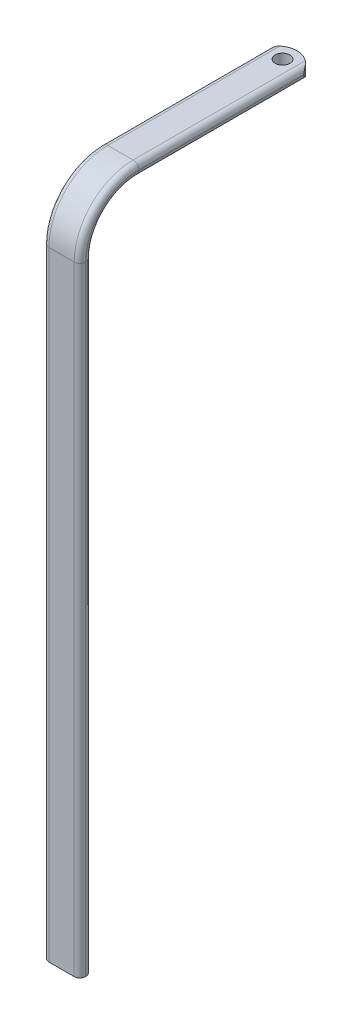
ISO-10303-21;
HEADER;
FILE_DESCRIPTION(('STEP AP214'),'2;1');
FILE_NAME('part.step','',(''),(''),'','','');
FILE_SCHEMA(('AUTOMOTIVE_DESIGN { 1 0 10303 214 1 1 1 1 }'));
ENDSEC;
DATA;
#1=APPLICATION_CONTEXT('core data for automotive mechanical design processes');
#2=APPLICATION_PROTOCOL_DEFINITION('international standard','automotive_design',2000,#1);
#3=PRODUCT_CONTEXT('',#1,'mechanical');
#4=PRODUCT('Part','Part','',(#3));
#5=PRODUCT_RELATED_PRODUCT_CATEGORY('part','',(#4));
#6=PRODUCT_DEFINITION_FORMATION('','',#4);
#7=PRODUCT_DEFINITION_CONTEXT('part definition',#1,'design');
#8=PRODUCT_DEFINITION('design','',#6,#7);
#9=PRODUCT_DEFINITION_SHAPE('','',#8);
#10=(LENGTH_UNIT() NAMED_UNIT(*) SI_UNIT(.MILLI.,.METRE.));
#11=(NAMED_UNIT(*) PLANE_ANGLE_UNIT() SI_UNIT($,.RADIAN.));
#12=(NAMED_UNIT(*) SI_UNIT($,.STERADIAN.) SOLID_ANGLE_UNIT());
#13=UNCERTAINTY_MEASURE_WITH_UNIT(LENGTH_MEASURE(1.E-05),#10,'distance_accuracy_value','');
#14=(GEOMETRIC_REPRESENTATION_CONTEXT(3) GLOBAL_UNCERTAINTY_ASSIGNED_CONTEXT((#13)) GLOBAL_UNIT_ASSIGNED_CONTEXT((#10,
#11,#12)) REPRESENTATION_CONTEXT('',''));
#15=CARTESIAN_POINT('',(0.,0.,0.));
#16=DIRECTION('',(0.,0.,1.));
#17=DIRECTION('',(1.,0.,0.));
#18=AXIS2_PLACEMENT_3D('',#15,#16,#17);
#19=CARTESIAN_POINT('',(10.5,227.9,-20.));
#20=DIRECTION('',(0.,0.,-1.));
#21=DIRECTION('',(-1.,0.,0.));
#22=AXIS2_PLACEMENT_3D('',#19,#20,#21);
#23=CYLINDRICAL_SURFACE('',#22,1.9);
#24=CARTESIAN_POINT('',(12.4,227.9,-76.));
#25=CARTESIAN_POINT('',(12.4000039886726,227.873806271057,-75.9999888760673));
#26=CARTESIAN_POINT('',(12.3994579999188,227.847629320959,-76.0011409460232));
#27=CARTESIAN_POINT('',(12.397304870018,227.795553200889,-76.0056674990028));
#28=CARTESIAN_POINT('',(12.3956994282265,227.76965365346,-76.0090384229779));
#29=CARTESIAN_POINT('',(12.3894132316495,227.693386741234,-76.0221958260334));
#30=CARTESIAN_POINT('',(12.3832599744014,227.643648484299,-76.0350337198619));
#31=CARTESIAN_POINT('',(12.3650460932504,227.531486133612,-76.0725608007253));
#32=CARTESIAN_POINT('',(12.3517217413397,227.470129793832,-76.0997341911328));
#33=CARTESIAN_POINT('',(12.3204537034474,227.352563779117,-76.1620964892458));
#34=CARTESIAN_POINT('',(12.3024787910066,227.296392520357,-76.1973393886364));
#35=CARTESIAN_POINT('',(12.2648834983558,227.194424899646,-76.2692324559926));
#36=CARTESIAN_POINT('',(12.2456020458715,227.148151936548,-76.3053981234561));
#37=CARTESIAN_POINT('',(12.2045361049354,227.059194070327,-76.3806343366665));
#38=CARTESIAN_POINT('',(12.182749574176,227.016512144653,-76.4197072432999));
#39=CARTESIAN_POINT('',(12.1140115543373,226.893084345266,-76.5399913060167));
#40=CARTESIAN_POINT('',(12.0637290121805,226.817078091103,-76.6241751603708));
#41=CARTESIAN_POINT('',(11.9630742501943,226.685395994687,-76.7841452811863));
#42=CARTESIAN_POINT('',(11.9136882346023,226.628362870559,-76.8594699167269));
#43=CARTESIAN_POINT('',(11.8095009758109,226.521308748569,-77.0114480235751));
#44=CARTESIAN_POINT('',(11.7546964838332,226.471292001546,-77.0881022690948));
#45=CARTESIAN_POINT('',(11.639968401803,226.378185992107,-77.2415341391299));
#46=CARTESIAN_POINT('',(11.5800531686587,226.335085740463,-77.3183113681883));
#47=CARTESIAN_POINT('',(11.4551452797332,226.255869654153,-77.4713341410249));
#48=CARTESIAN_POINT('',(11.3901532407727,226.219752972846,-77.5475797481717));
#49=CARTESIAN_POINT('',(11.2616930004956,226.158046605552,-77.6916086026697));
#50=CARTESIAN_POINT('',(11.1986748223333,226.131780053465,-77.7595030517766));
#51=CARTESIAN_POINT('',(11.0687886474057,226.085827399774,-77.8937801321461));
#52=CARTESIAN_POINT('',(11.0019222800155,226.066138536772,-77.9601633868931));
#53=CARTESIAN_POINT('',(10.8644206281101,226.03393578905,-78.0910760597136));
#54=CARTESIAN_POINT('',(10.7937776209771,226.021437272592,-78.1556012290506));
#55=CARTESIAN_POINT('',(10.6492123958767,226.004472132983,-78.2821795880287));
#56=CARTESIAN_POINT('',(10.5752855586271,226.000017216354,-78.3442290464292));
#57=CARTESIAN_POINT('',(10.5,226.,-78.4047103832078));
#58=B_SPLINE_CURVE_WITH_KNOTS('',3,(#24,#25,#26,#27,#28,#29,#30,#31,#32,#33,#34,#35,#36,#37,#38,
#39,#40,#41,#42,#43,#44,#45,#46,#47,#48,#49,#50,#51,#52,#53,#54,#55,#56,#57),.UNSPECIFIED.,.F.,
.F.,(4,2,2,2,2,2,2,2,2,2,2,2,2,2,2,2,4),(0.,0.0785202128572147,0.156914784965549,
0.311333860283347,0.515440192471966,0.720954279759613,0.906128226338106,1.09145422406289,
1.4625817243948,1.78206370568672,2.1017384153395,2.42090007255307,2.74002301247223,
3.02858760718773,3.31703090607165,3.60608843936753,3.89556632411547),.UNSPECIFIED.);
#59=CARTESIAN_POINT('',(12.4,227.9,-76.));
#60=VERTEX_POINT('',#59);
#61=CARTESIAN_POINT('',(10.5,226.,-78.4047103832078));
#62=VERTEX_POINT('',#61);
#63=EDGE_CURVE('E183',#60,#62,#58,.T.);
#64=ORIENTED_EDGE('',*,*,#63,.F.);
#65=DIRECTION('',(0.,0.,-1.));
#66=VECTOR('',#65,1.);
#67=CARTESIAN_POINT('',(12.4,227.9,-20.));
#68=LINE('',#67,#66);
#69=CARTESIAN_POINT('',(12.4,227.9,-20.));
#70=VERTEX_POINT('',#69);
#71=EDGE_CURVE('E25',#70,#60,#68,.T.);
#72=ORIENTED_EDGE('',*,*,#71,.F.);
#73=CARTESIAN_POINT('',(10.5,227.9,-20.));
#74=DIRECTION('',(0.,0.,-1.));
#75=DIRECTION('',(0.,-1.,0.));
#76=AXIS2_PLACEMENT_3D('',#73,#74,#75);
#77=CIRCLE('',#76,1.9);
#78=CARTESIAN_POINT('',(10.5,226.,-20.));
#79=VERTEX_POINT('',#78);
#80=EDGE_CURVE('E181',#70,#79,#77,.T.);
#81=ORIENTED_EDGE('',*,*,#80,.T.);
#82=DIRECTION('',(0.,0.,-1.));
#83=VECTOR('',#82,1.);
#84=CARTESIAN_POINT('',(10.5,226.,-20.));
#85=LINE('',#84,#83);
#86=EDGE_CURVE('E170',#79,#62,#85,.T.);
#87=ORIENTED_EDGE('',*,*,#86,.T.);
#88=EDGE_LOOP('',(#64,#72,#81,#87));
#89=FACE_BOUND('',#88,.T.);
#90=ADVANCED_FACE('F17',(#89),#23,.T.);
#91=CARTESIAN_POINT('',(1.9,226.,-20.));
#92=DIRECTION('',(0.,-1.,0.));
#93=DIRECTION('',(0.,0.,-1.));
#94=AXIS2_PLACEMENT_3D('',#91,#92,#93);
#95=PLANE('',#94);
#96=CARTESIAN_POINT('',(6.2,226.,-73.0542465172055));
#97=DIRECTION('',(0.,-1.,0.));
#98=DIRECTION('',(0.,0.,-1.));
#99=AXIS2_PLACEMENT_3D('',#96,#97,#98);
#100=CIRCLE('',#99,6.86421616656962);
#101=CARTESIAN_POINT('',(1.9,226.,-78.4047103832078));
#102=VERTEX_POINT('',#101);
#103=EDGE_CURVE('E335',#62,#102,#100,.F.);
#104=ORIENTED_EDGE('',*,*,#103,.F.);
#105=ORIENTED_EDGE('',*,*,#86,.F.);
#106=DIRECTION('',(-1.,0.,0.));
#107=VECTOR('',#106,1.);
#108=CARTESIAN_POINT('',(1.9,226.,-20.));
#109=LINE('',#108,#107);
#110=CARTESIAN_POINT('',(1.9,226.,-20.));
#111=VERTEX_POINT('',#110);
#112=EDGE_CURVE('E190',#79,#111,#109,.T.);
#113=ORIENTED_EDGE('',*,*,#112,.T.);
#114=DIRECTION('',(0.,0.,-1.));
#115=VECTOR('',#114,1.);
#116=CARTESIAN_POINT('',(1.9,226.,-20.));
#117=LINE('',#116,#115);
#118=EDGE_CURVE('E167',#111,#102,#117,.T.);
#119=ORIENTED_EDGE('',*,*,#118,.T.);
#120=EDGE_LOOP('',(#104,#105,#113,#119));
#121=FACE_BOUND('',#120,.T.);
#122=CARTESIAN_POINT('',(6.2,226.,-75.));
#123=DIRECTION('',(0.,-1.,0.));
#124=DIRECTION('',(0.,0.,-1.));
#125=AXIS2_PLACEMENT_3D('',#122,#123,#124);
#126=CIRCLE('',#125,2.5);
#127=CARTESIAN_POINT('',(6.2,226.,-77.5));
#128=VERTEX_POINT('',#127);
#129=EDGE_CURVE('E239',#128,#128,#126,.T.);
#130=ORIENTED_EDGE('',*,*,#129,.F.);
#131=EDGE_LOOP('',(#130));
#132=FACE_BOUND('',#131,.T.);
#133=ADVANCED_FACE('F338',(#121,#132),#95,.T.);
#134=CARTESIAN_POINT('',(1.9,227.9,-20.));
#135=DIRECTION('',(0.,0.,-1.));
#136=DIRECTION('',(-1.,0.,0.));
#137=AXIS2_PLACEMENT_3D('',#134,#135,#136);
#138=CYLINDRICAL_SURFACE('',#137,1.9);
#139=CARTESIAN_POINT('',(1.9,226.,-78.4047103832078));
#140=CARTESIAN_POINT('',(1.83711279584305,226.000008274471,-78.3541786712364));
#141=CARTESIAN_POINT('',(1.775170071014,226.003120622737,-78.302563320145));
#142=CARTESIAN_POINT('',(1.65350580345606,226.01506521073,-78.1975223643931));
#143=CARTESIAN_POINT('',(1.59378215319916,226.023891868533,-78.1440985744878));
#144=CARTESIAN_POINT('',(1.4187628353019,226.058122961575,-77.9819674964389));
#145=CARTESIAN_POINT('',(1.30706964261362,226.091287175651,-77.8709575772025));
#146=CARTESIAN_POINT('',(1.08145650570991,226.180547254876,-77.6311832773445));
#147=CARTESIAN_POINT('',(0.968995038522396,226.238986597781,-77.5019308637489));
#148=CARTESIAN_POINT('',(0.811244001702309,226.341619814429,-77.3069882763855));
#149=CARTESIAN_POINT('',(0.760414878017264,226.378394010338,-77.2417299665403));
#150=CARTESIAN_POINT('',(0.662518809556247,226.456887495647,-77.1113897724482));
#151=CARTESIAN_POINT('',(0.61545116074426,226.498605855999,-77.0463078573991));
#152=CARTESIAN_POINT('',(0.499741425241474,226.611951714494,-76.8804263373852));
#153=CARTESIAN_POINT('',(0.433843529875936,226.687210032873,-76.7801126968921));
#154=CARTESIAN_POINT('',(0.342708118865225,226.810309845184,-76.633759864111));
#155=CARTESIAN_POINT('',(0.313642348855369,226.852993172531,-76.5857119309615));
#156=CARTESIAN_POINT('',(0.258237415794232,226.942202660478,-76.4916709751971));
#157=CARTESIAN_POINT('',(0.231896669542325,226.988726561185,-76.4456767683262));
#158=CARTESIAN_POINT('',(0.182091384395307,227.086476858022,-76.3564977677626));
#159=CARTESIAN_POINT('',(0.158645614768199,227.137730523617,-76.3133320805189));
#160=CARTESIAN_POINT('',(0.115354718208621,227.245468026654,-76.2317739137346));
#161=CARTESIAN_POINT('',(0.0955111830883199,227.301954159731,-76.1933835467353));
#162=CARTESIAN_POINT('',(0.0631364467011609,227.41146989876,-76.1295428045705));
#163=CARTESIAN_POINT('',(0.0499469970744282,227.463658512826,-76.1030076872775));
#164=CARTESIAN_POINT('',(0.0277132533765342,227.572020212111,-76.0577409086192));
#165=CARTESIAN_POINT('',(0.0186497365536778,227.628173381991,-76.0389730972916));
#166=CARTESIAN_POINT('',(0.00816096168706774,227.720636529829,-76.0171304086468));
#167=CARTESIAN_POINT('',(0.00513223286449089,227.755997369045,-76.0107841779591));
#168=CARTESIAN_POINT('',(0.00103738972427453,227.827550977197,-76.0021836597316));
#169=CARTESIAN_POINT('',(-1.59185047112454E-05,227.863747644961,-75.9999560734959));
#170=CARTESIAN_POINT('',(0.,227.9,-76.));
#171=B_SPLINE_CURVE_WITH_KNOTS('',3,(#139,#140,#141,#142,#143,#144,#145,#146,#147,#148,#149,
#150,#151,#152,#153,#154,#155,#156,#157,#158,#159,#160,#161,#162,#163,#164,#165,#166,#167,#168,
#169,#170),.UNSPECIFIED.,.F.,.F.,(4,2,2,2,2,2,2,2,2,2,2,2,2,2,2,4),(0.,0.241855605073987,
0.483475313448054,0.964620469544646,1.50575154197843,1.77714431394214,2.04848616971289,
2.47234804889616,2.68381907541955,2.8951665419806,3.10781936290637,3.32056592667132,
3.50004060914779,3.67867033789836,3.78655306933386,3.89513278817063),.UNSPECIFIED.);
#172=CARTESIAN_POINT('',(0.,227.9,-76.));
#173=VERTEX_POINT('',#172);
#174=EDGE_CURVE('E32',#102,#173,#171,.T.);
#175=ORIENTED_EDGE('',*,*,#174,.F.);
#176=ORIENTED_EDGE('',*,*,#118,.F.);
#177=CARTESIAN_POINT('',(1.9,227.9,-20.));
#178=DIRECTION('',(0.,0.,-1.));
#179=DIRECTION('',(0.,-1.,0.));
#180=AXIS2_PLACEMENT_3D('',#177,#178,#179);
#181=CIRCLE('',#180,1.9);
#182=CARTESIAN_POINT('',(0.,227.9,-20.));
#183=VERTEX_POINT('',#182);
#184=EDGE_CURVE('E196',#111,#183,#181,.T.);
#185=ORIENTED_EDGE('',*,*,#184,.T.);
#186=DIRECTION('',(0.,0.,-1.));
#187=VECTOR('',#186,1.);
#188=CARTESIAN_POINT('',(0.,227.9,-20.));
#189=LINE('',#188,#187);
#190=EDGE_CURVE('E159',#183,#173,#189,.T.);
#191=ORIENTED_EDGE('',*,*,#190,.T.);
#192=EDGE_LOOP('',(#175,#176,#185,#191));
#193=FACE_BOUND('',#192,.T.);
#194=ADVANCED_FACE('F294',(#193),#138,.T.);
#195=CARTESIAN_POINT('',(1.9,228.1,-20.));
#196=DIRECTION('',(0.,0.,-1.));
#197=DIRECTION('',(-1.,0.,0.));
#198=AXIS2_PLACEMENT_3D('',#195,#196,#197);
#199=CYLINDRICAL_SURFACE('',#198,1.9);
#200=CARTESIAN_POINT('',(0.,228.1,-76.));
#201=CARTESIAN_POINT('',(-3.98867262817255E-06,228.126193728943,-75.9999888760673));
#202=CARTESIAN_POINT('',(0.000542000081220153,228.152370679041,-76.0011409460232));
#203=CARTESIAN_POINT('',(0.00269512998195583,228.204446799111,-76.0056674990028));
#204=CARTESIAN_POINT('',(0.00430057177346251,228.23034634654,-76.0090384229779));
#205=CARTESIAN_POINT('',(0.0105867683505166,228.306613258766,-76.0221958260334));
#206=CARTESIAN_POINT('',(0.0167400255985739,228.356351515701,-76.0350337198619));
#207=CARTESIAN_POINT('',(0.0349539067496436,228.468513866389,-76.0725608007253));
#208=CARTESIAN_POINT('',(0.0482782586603467,228.529870206169,-76.0997341911329));
#209=CARTESIAN_POINT('',(0.0795462965526777,228.647436220883,-76.1620964892459));
#210=CARTESIAN_POINT('',(0.0975212089934196,228.703607479644,-76.1973393886364));
#211=CARTESIAN_POINT('',(0.135116501644238,228.805575100355,-76.2692324559926));
#212=CARTESIAN_POINT('',(0.154397954128531,228.851848063452,-76.3053981234562));
#213=CARTESIAN_POINT('',(0.195463895064684,228.940805929673,-76.3806343366666));
#214=CARTESIAN_POINT('',(0.217250425824034,228.983487855347,-76.4197072433001));
#215=CARTESIAN_POINT('',(0.285988445662687,229.106915654734,-76.5399913060167));
#216=CARTESIAN_POINT('',(0.336270987819435,229.182921908897,-76.6241751603708));
#217=CARTESIAN_POINT('',(0.436925749805716,229.314604005313,-76.7841452811863));
#218=CARTESIAN_POINT('',(0.486311765397746,229.371637129441,-76.8594699167269));
#219=CARTESIAN_POINT('',(0.590499024189134,229.478691251431,-77.0114480235751));
#220=CARTESIAN_POINT('',(0.645303516166796,229.528707998454,-77.0881022690948));
#221=CARTESIAN_POINT('',(0.760031598197047,229.621814007893,-77.2415341391299));
#222=CARTESIAN_POINT('',(0.819946831341359,229.664914259537,-77.3183113681883));
#223=CARTESIAN_POINT('',(0.944854720266765,229.744130345847,-77.4713341410249));
#224=CARTESIAN_POINT('',(1.00984675922729,229.780247027154,-77.5475797481717));
#225=CARTESIAN_POINT('',(1.13830699950432,229.841953394448,-77.6916086026697));
#226=CARTESIAN_POINT('',(1.20132517766663,229.868219946535,-77.7595030517766));
#227=CARTESIAN_POINT('',(1.3312113525943,229.914172600225,-77.893780132146));
#228=CARTESIAN_POINT('',(1.39807771998452,229.933861463228,-77.9601633868931));
#229=CARTESIAN_POINT('',(1.53557937188988,229.96606421095,-78.0910760597136));
#230=CARTESIAN_POINT('',(1.60622237902287,229.978562727408,-78.1556012290505));
#231=CARTESIAN_POINT('',(1.75078760412331,229.995527867017,-78.2821795880287));
#232=CARTESIAN_POINT('',(1.82471444137294,229.999982783646,-78.3442290464292));
#233=CARTESIAN_POINT('',(1.9,230.,-78.4047103832078));
#234=B_SPLINE_CURVE_WITH_KNOTS('',3,(#200,#201,#202,#203,#204,#205,#206,#207,#208,#209,#210,
#211,#212,#213,#214,#215,#216,#217,#218,#219,#220,#221,#222,#223,#224,#225,#226,#227,#228,#229,
#230,#231,#232,#233),.UNSPECIFIED.,.F.,.F.,(4,2,2,2,2,2,2,2,2,2,2,2,2,2,2,2,4),(0.,
0.0785202128572147,0.156914784965521,0.311333860283372,0.515440192472223,0.720954279760026,
0.906128226338375,1.09145422406306,1.46258172439484,1.78206370568678,2.10173841533957,
2.42090007255312,2.74002301247225,3.02858760718774,3.31703090607163,3.60608843936757,
3.89556632411551),.UNSPECIFIED.);
#235=CARTESIAN_POINT('',(0.,228.1,-76.));
#236=VERTEX_POINT('',#235);
#237=CARTESIAN_POINT('',(1.9,230.,-78.4047103832078));
#238=VERTEX_POINT('',#237);
#239=EDGE_CURVE('E132',#236,#238,#234,.T.);
#240=ORIENTED_EDGE('',*,*,#239,.F.);
#241=DIRECTION('',(0.,0.,-1.));
#242=VECTOR('',#241,1.);
#243=CARTESIAN_POINT('',(0.,228.1,-20.));
#244=LINE('',#243,#242);
#245=CARTESIAN_POINT('',(0.,228.1,-20.));
#246=VERTEX_POINT('',#245);
#247=EDGE_CURVE('E157',#246,#236,#244,.T.);
#248=ORIENTED_EDGE('',*,*,#247,.F.);
#249=CARTESIAN_POINT('',(1.9,228.1,-20.));
#250=DIRECTION('',(0.,0.,-1.));
#251=DIRECTION('',(0.,-1.,0.));
#252=AXIS2_PLACEMENT_3D('',#249,#250,#251);
#253=CIRCLE('',#252,1.9);
#254=CARTESIAN_POINT('',(1.9,230.,-20.));
#255=VERTEX_POINT('',#254);
#256=EDGE_CURVE('E155',#246,#255,#253,.T.);
#257=ORIENTED_EDGE('',*,*,#256,.T.);
#258=DIRECTION('',(0.,0.,-1.));
#259=VECTOR('',#258,1.);
#260=CARTESIAN_POINT('',(1.9,230.,-20.));
#261=LINE('',#260,#259);
#262=EDGE_CURVE('E148',#255,#238,#261,.T.);
#263=ORIENTED_EDGE('',*,*,#262,.T.);
#264=EDGE_LOOP('',(#240,#248,#257,#263));
#265=FACE_BOUND('',#264,.T.);
#266=ADVANCED_FACE('F153',(#265),#199,.T.);
#267=CARTESIAN_POINT('',(1.9,230.,-20.));
#268=DIRECTION('',(0.,1.,0.));
#269=DIRECTION('',(0.,0.,1.));
#270=AXIS2_PLACEMENT_3D('',#267,#268,#269);
#271=PLANE('',#270);
#272=CARTESIAN_POINT('',(6.2,230.,-73.0542465172055));
#273=DIRECTION('',(0.,-1.,0.));
#274=DIRECTION('',(0.,0.,-1.));
#275=AXIS2_PLACEMENT_3D('',#272,#273,#274);
#276=CIRCLE('',#275,6.86421616656962);
#277=CARTESIAN_POINT('',(10.5,230.,-78.4047103832078));
#278=VERTEX_POINT('',#277);
#279=EDGE_CURVE('E135',#238,#278,#276,.T.);
#280=ORIENTED_EDGE('',*,*,#279,.F.);
#281=ORIENTED_EDGE('',*,*,#262,.F.);
#282=DIRECTION('',(1.,0.,0.));
#283=VECTOR('',#282,1.);
#284=CARTESIAN_POINT('',(1.9,230.,-20.));
#285=LINE('',#284,#283);
#286=CARTESIAN_POINT('',(10.5,230.,-20.));
#287=VERTEX_POINT('',#286);
#288=EDGE_CURVE('E289',#255,#287,#285,.T.);
#289=ORIENTED_EDGE('',*,*,#288,.T.);
#290=DIRECTION('',(0.,0.,-1.));
#291=VECTOR('',#290,1.);
#292=CARTESIAN_POINT('',(10.5,230.,-20.));
#293=LINE('',#292,#291);
#294=EDGE_CURVE('E150',#287,#278,#293,.T.);
#295=ORIENTED_EDGE('',*,*,#294,.T.);
#296=EDGE_LOOP('',(#280,#281,#289,#295));
#297=FACE_BOUND('',#296,.T.);
#298=CARTESIAN_POINT('',(6.2,230.,-75.));
#299=DIRECTION('',(0.,1.,0.));
#300=DIRECTION('',(0.,0.,1.));
#301=AXIS2_PLACEMENT_3D('',#298,#299,#300);
#302=CIRCLE('',#301,2.5);
#303=CARTESIAN_POINT('',(6.2,230.,-72.5));
#304=VERTEX_POINT('',#303);
#305=EDGE_CURVE('E248',#304,#304,#302,.T.);
#306=ORIENTED_EDGE('',*,*,#305,.F.);
#307=EDGE_LOOP('',(#306));
#308=FACE_BOUND('',#307,.T.);
#309=ADVANCED_FACE('F145',(#297,#308),#271,.T.);
#310=CARTESIAN_POINT('',(10.5,228.1,-20.));
#311=DIRECTION('',(0.,0.,-1.));
#312=DIRECTION('',(-1.,0.,0.));
#313=AXIS2_PLACEMENT_3D('',#310,#311,#312);
#314=CYLINDRICAL_SURFACE('',#313,1.9);
#315=CARTESIAN_POINT('',(10.5,230.,-78.4047103832078));
#316=CARTESIAN_POINT('',(10.562887204157,229.999991725529,-78.3541786712364));
#317=CARTESIAN_POINT('',(10.624829928986,229.996879377263,-78.302563320145));
#318=CARTESIAN_POINT('',(10.7464941965439,229.98493478927,-78.1975223643931));
#319=CARTESIAN_POINT('',(10.8062178468009,229.976108131467,-78.1440985744878));
#320=CARTESIAN_POINT('',(10.9812371646981,229.941877038425,-77.9819674964389));
#321=CARTESIAN_POINT('',(11.0929303573864,229.908712824349,-77.8709575772025));
#322=CARTESIAN_POINT('',(11.3185434942901,229.819452745124,-77.6311832773445));
#323=CARTESIAN_POINT('',(11.4310049614776,229.761013402219,-77.5019308637489));
#324=CARTESIAN_POINT('',(11.5887559982977,229.658380185571,-77.3069882763855));
#325=CARTESIAN_POINT('',(11.6395851219827,229.621605989662,-77.2417299665403));
#326=CARTESIAN_POINT('',(11.7374811904437,229.543112504353,-77.1113897724482));
#327=CARTESIAN_POINT('',(11.7845488392557,229.501394144001,-77.0463078573991));
#328=CARTESIAN_POINT('',(11.9002585747585,229.388048285506,-76.8804263373852));
#329=CARTESIAN_POINT('',(11.9661564701241,229.312789967127,-76.7801126968921));
#330=CARTESIAN_POINT('',(12.0572918811348,229.189690154816,-76.633759864111));
#331=CARTESIAN_POINT('',(12.0863576511446,229.147006827469,-76.5857119309614));
#332=CARTESIAN_POINT('',(12.1417625842058,229.057797339522,-76.4916709751971));
#333=CARTESIAN_POINT('',(12.1681033304577,229.011273438815,-76.4456767683262));
#334=CARTESIAN_POINT('',(12.2179086156047,228.913523141978,-76.3564977677626));
#335=CARTESIAN_POINT('',(12.2413543852318,228.862269476383,-76.3133320805189));
#336=CARTESIAN_POINT('',(12.2846452817914,228.754531973346,-76.2317739137346));
#337=CARTESIAN_POINT('',(12.3044888169117,228.698045840269,-76.1933835467353));
#338=CARTESIAN_POINT('',(12.3368635532988,228.58853010124,-76.1295428045706));
#339=CARTESIAN_POINT('',(12.3500530029255,228.536341487174,-76.1030076872777));
#340=CARTESIAN_POINT('',(12.3722867466234,228.42797978789,-76.0577409086192));
#341=CARTESIAN_POINT('',(12.3813502634463,228.37182661801,-76.0389730972916));
#342=CARTESIAN_POINT('',(12.3918390383129,228.279363470171,-76.0171304086468));
#343=CARTESIAN_POINT('',(12.3948677671355,228.244002630955,-76.0107841779592));
#344=CARTESIAN_POINT('',(12.3989626102757,228.172449022803,-76.0021836597316));
#345=CARTESIAN_POINT('',(12.4000159185047,228.136252355039,-75.999956073496));
#346=CARTESIAN_POINT('',(12.4,228.1,-76.));
#347=B_SPLINE_CURVE_WITH_KNOTS('',3,(#315,#316,#317,#318,#319,#320,#321,#322,#323,#324,#325,
#326,#327,#328,#329,#330,#331,#332,#333,#334,#335,#336,#337,#338,#339,#340,#341,#342,#343,#344,
#345,#346),.UNSPECIFIED.,.F.,.F.,(4,2,2,2,2,2,2,2,2,2,2,2,2,2,2,4),(0.,0.24185560507399,
0.483475313448062,0.964620469544648,1.50575154197843,1.77714431394214,2.04848616971289,
2.47234804889617,2.68381907541961,2.8951665419806,3.10781936290637,3.32056592667132,
3.50004060914752,3.67867033789787,3.78655306933361,3.89513278817065),.UNSPECIFIED.);
#348=CARTESIAN_POINT('',(12.4,228.1,-76.));
#349=VERTEX_POINT('',#348);
#350=EDGE_CURVE('E141',#278,#349,#347,.T.);
#351=ORIENTED_EDGE('',*,*,#350,.F.);
#352=ORIENTED_EDGE('',*,*,#294,.F.);
#353=CARTESIAN_POINT('',(10.5,228.1,-20.));
#354=DIRECTION('',(0.,0.,-1.));
#355=DIRECTION('',(0.,1.,0.));
#356=AXIS2_PLACEMENT_3D('',#353,#354,#355);
#357=CIRCLE('',#356,1.9);
#358=CARTESIAN_POINT('',(12.4,228.1,-20.));
#359=VERTEX_POINT('',#358);
#360=EDGE_CURVE('E217',#287,#359,#357,.T.);
#361=ORIENTED_EDGE('',*,*,#360,.T.);
#362=DIRECTION('',(0.,0.,-1.));
#363=VECTOR('',#362,1.);
#364=CARTESIAN_POINT('',(12.4,228.1,-20.));
#365=LINE('',#364,#363);
#366=EDGE_CURVE('E11',#359,#349,#365,.T.);
#367=ORIENTED_EDGE('',*,*,#366,.T.);
#368=EDGE_LOOP('',(#351,#352,#361,#367));
#369=FACE_BOUND('',#368,.T.);
#370=ADVANCED_FACE('F317',(#369),#314,.T.);
#371=CARTESIAN_POINT('',(10.5,210.,-20.));
#372=DIRECTION('',(-1.,0.,0.));
#373=DIRECTION('',(0.,0.,1.));
#374=AXIS2_PLACEMENT_3D('',#371,#372,#373);
#375=TOROIDAL_SURFACE('',#374,17.9,1.9);
#376=CARTESIAN_POINT('',(10.5,210.,-2.1));
#377=DIRECTION('',(0.,1.,0.));
#378=DIRECTION('',(0.,0.,-1.));
#379=AXIS2_PLACEMENT_3D('',#376,#377,#378);
#380=CIRCLE('',#379,1.9);
#381=CARTESIAN_POINT('',(12.4,210.,-2.1));
#382=VERTEX_POINT('',#381);
#383=CARTESIAN_POINT('',(10.5,210.,-4.));
#384=VERTEX_POINT('',#383);
#385=EDGE_CURVE('E362',#382,#384,#380,.T.);
#386=ORIENTED_EDGE('',*,*,#385,.T.);
#387=CARTESIAN_POINT('',(10.5,210.,-20.));
#388=DIRECTION('',(-1.,0.,0.));
#389=DIRECTION('',(0.,0.,1.));
#390=AXIS2_PLACEMENT_3D('',#387,#388,#389);
#391=CIRCLE('',#390,16.);
#392=EDGE_CURVE('E188',#384,#79,#391,.T.);
#393=ORIENTED_EDGE('',*,*,#392,.T.);
#394=ORIENTED_EDGE('',*,*,#80,.F.);
#395=CARTESIAN_POINT('',(12.4,210.,-20.));
#396=DIRECTION('',(-1.,0.,0.));
#397=DIRECTION('',(0.,0.,1.));
#398=AXIS2_PLACEMENT_3D('',#395,#396,#397);
#399=CIRCLE('',#398,17.9);
#400=EDGE_CURVE('E176',#382,#70,#399,.T.);
#401=ORIENTED_EDGE('',*,*,#400,.F.);
#402=EDGE_LOOP('',(#386,#393,#394,#401));
#403=FACE_BOUND('',#402,.T.);
#404=ADVANCED_FACE('F187',(#403),#375,.T.);
#405=CARTESIAN_POINT('',(0.,210.,-20.));
#406=DIRECTION('',(-1.,0.,0.));
#407=DIRECTION('',(0.,0.,1.));
#408=AXIS2_PLACEMENT_3D('',#405,#406,#407);
#409=CYLINDRICAL_SURFACE('',#408,16.);
#410=DIRECTION('',(-1.,0.,0.));
#411=VECTOR('',#410,1.);
#412=CARTESIAN_POINT('',(1.9,210.,-4.));
#413=LINE('',#412,#411);
#414=CARTESIAN_POINT('',(1.9,210.,-4.));
#415=VERTEX_POINT('',#414);
#416=EDGE_CURVE('E364',#384,#415,#413,.T.);
#417=ORIENTED_EDGE('',*,*,#416,.T.);
#418=CARTESIAN_POINT('',(1.9,210.,-20.));
#419=DIRECTION('',(-1.,0.,0.));
#420=DIRECTION('',(0.,0.,1.));
#421=AXIS2_PLACEMENT_3D('',#418,#419,#420);
#422=CIRCLE('',#421,16.);
#423=EDGE_CURVE('E208',#415,#111,#422,.T.);
#424=ORIENTED_EDGE('',*,*,#423,.T.);
#425=ORIENTED_EDGE('',*,*,#112,.F.);
#426=ORIENTED_EDGE('',*,*,#392,.F.);
#427=EDGE_LOOP('',(#417,#424,#425,#426));
#428=FACE_BOUND('',#427,.T.);
#429=ADVANCED_FACE('F392',(#428),#409,.F.);
#430=CARTESIAN_POINT('',(1.9,210.,-20.));
#431=DIRECTION('',(-1.,0.,0.));
#432=DIRECTION('',(0.,0.,1.));
#433=AXIS2_PLACEMENT_3D('',#430,#431,#432);
#434=TOROIDAL_SURFACE('',#433,17.9,1.9);
#435=CARTESIAN_POINT('',(1.9,210.,-2.1));
#436=DIRECTION('',(0.,1.,0.));
#437=DIRECTION('',(0.,0.,-1.));
#438=AXIS2_PLACEMENT_3D('',#435,#436,#437);
#439=CIRCLE('',#438,1.9);
#440=CARTESIAN_POINT('',(0.,210.,-2.1));
#441=VERTEX_POINT('',#440);
#442=EDGE_CURVE('E299',#415,#441,#439,.T.);
#443=ORIENTED_EDGE('',*,*,#442,.T.);
#444=CARTESIAN_POINT('',(0.,210.,-20.));
#445=DIRECTION('',(-1.,0.,0.));
#446=DIRECTION('',(0.,0.,1.));
#447=AXIS2_PLACEMENT_3D('',#444,#445,#446);
#448=CIRCLE('',#447,17.9);
#449=EDGE_CURVE('E205',#441,#183,#448,.T.);
#450=ORIENTED_EDGE('',*,*,#449,.T.);
#451=ORIENTED_EDGE('',*,*,#184,.F.);
#452=ORIENTED_EDGE('',*,*,#423,.F.);
#453=EDGE_LOOP('',(#443,#450,#451,#452));
#454=FACE_BOUND('',#453,.T.);
#455=ADVANCED_FACE('F297',(#454),#434,.T.);
#456=CARTESIAN_POINT('',(1.9,210.,-20.));
#457=DIRECTION('',(-1.,0.,0.));
#458=DIRECTION('',(0.,0.,1.));
#459=AXIS2_PLACEMENT_3D('',#456,#457,#458);
#460=TOROIDAL_SURFACE('',#459,18.1,1.9);
#461=CARTESIAN_POINT('',(1.9,210.,-1.9));
#462=DIRECTION('',(0.,1.,0.));
#463=DIRECTION('',(0.,0.,-1.));
#464=AXIS2_PLACEMENT_3D('',#461,#462,#463);
#465=CIRCLE('',#464,1.9);
#466=CARTESIAN_POINT('',(0.,210.,-1.9));
#467=VERTEX_POINT('',#466);
#468=CARTESIAN_POINT('',(1.9,210.,0.));
#469=VERTEX_POINT('',#468);
#470=EDGE_CURVE('E367',#467,#469,#465,.T.);
#471=ORIENTED_EDGE('',*,*,#470,.T.);
#472=CARTESIAN_POINT('',(1.9,210.,-20.));
#473=DIRECTION('',(-1.,0.,0.));
#474=DIRECTION('',(0.,0.,1.));
#475=AXIS2_PLACEMENT_3D('',#472,#473,#474);
#476=CIRCLE('',#475,20.);
#477=EDGE_CURVE('E193',#469,#255,#476,.T.);
#478=ORIENTED_EDGE('',*,*,#477,.T.);
#479=ORIENTED_EDGE('',*,*,#256,.F.);
#480=CARTESIAN_POINT('',(0.,210.,-20.));
#481=DIRECTION('',(-1.,0.,0.));
#482=DIRECTION('',(0.,0.,1.));
#483=AXIS2_PLACEMENT_3D('',#480,#481,#482);
#484=CIRCLE('',#483,18.1);
#485=EDGE_CURVE('E202',#467,#246,#484,.T.);
#486=ORIENTED_EDGE('',*,*,#485,.F.);
#487=EDGE_LOOP('',(#471,#478,#479,#486));
#488=FACE_BOUND('',#487,.T.);
#489=ADVANCED_FACE('F383',(#488),#460,.T.);
#490=CARTESIAN_POINT('',(0.,210.,-20.));
#491=DIRECTION('',(-1.,0.,0.));
#492=DIRECTION('',(0.,0.,1.));
#493=AXIS2_PLACEMENT_3D('',#490,#491,#492);
#494=CYLINDRICAL_SURFACE('',#493,20.);
#495=DIRECTION('',(1.,0.,0.));
#496=VECTOR('',#495,1.);
#497=CARTESIAN_POINT('',(1.9,210.,0.));
#498=LINE('',#497,#496);
#499=CARTESIAN_POINT('',(10.5,210.,0.));
#500=VERTEX_POINT('',#499);
#501=EDGE_CURVE('E251',#469,#500,#498,.T.);
#502=ORIENTED_EDGE('',*,*,#501,.T.);
#503=CARTESIAN_POINT('',(10.5,210.,-20.));
#504=DIRECTION('',(-1.,0.,0.));
#505=DIRECTION('',(0.,0.,1.));
#506=AXIS2_PLACEMENT_3D('',#503,#504,#505);
#507=CIRCLE('',#506,20.);
#508=EDGE_CURVE('E189',#500,#287,#507,.T.);
#509=ORIENTED_EDGE('',*,*,#508,.T.);
#510=ORIENTED_EDGE('',*,*,#288,.F.);
#511=ORIENTED_EDGE('',*,*,#477,.F.);
#512=EDGE_LOOP('',(#502,#509,#510,#511));
#513=FACE_BOUND('',#512,.T.);
#514=ADVANCED_FACE('F375',(#513),#494,.T.);
#515=CARTESIAN_POINT('',(10.5,210.,-20.));
#516=DIRECTION('',(-1.,0.,0.));
#517=DIRECTION('',(0.,0.,1.));
#518=AXIS2_PLACEMENT_3D('',#515,#516,#517);
#519=TOROIDAL_SURFACE('',#518,18.1,1.9);
#520=CARTESIAN_POINT('',(10.5,210.,-1.9));
#521=DIRECTION('',(0.,1.,0.));
#522=DIRECTION('',(0.,0.,1.));
#523=AXIS2_PLACEMENT_3D('',#520,#521,#522);
#524=CIRCLE('',#523,1.9);
#525=CARTESIAN_POINT('',(12.4,210.,-1.9));
#526=VERTEX_POINT('',#525);
#527=EDGE_CURVE('E219',#500,#526,#524,.T.);
#528=ORIENTED_EDGE('',*,*,#527,.T.);
#529=CARTESIAN_POINT('',(12.4,210.,-20.));
#530=DIRECTION('',(-1.,0.,0.));
#531=DIRECTION('',(0.,0.,1.));
#532=AXIS2_PLACEMENT_3D('',#529,#530,#531);
#533=CIRCLE('',#532,18.1);
#534=EDGE_CURVE('E161',#526,#359,#533,.T.);
#535=ORIENTED_EDGE('',*,*,#534,.T.);
#536=ORIENTED_EDGE('',*,*,#360,.F.);
#537=ORIENTED_EDGE('',*,*,#508,.F.);
#538=EDGE_LOOP('',(#528,#535,#536,#537));
#539=FACE_BOUND('',#538,.T.);
#540=ADVANCED_FACE('F216',(#539),#519,.T.);
#541=CARTESIAN_POINT('',(10.5,210.,-1.9));
#542=DIRECTION('',(0.,-1.,0.));
#543=DIRECTION('',(0.,0.,-1.));
#544=AXIS2_PLACEMENT_3D('',#541,#542,#543);
#545=CYLINDRICAL_SURFACE('',#544,1.9);
#546=CARTESIAN_POINT('',(10.5,0.,-1.9));
#547=DIRECTION('',(0.,1.,0.));
#548=DIRECTION('',(0.,0.,1.));
#549=AXIS2_PLACEMENT_3D('',#546,#547,#548);
#550=CIRCLE('',#549,1.9);
#551=CARTESIAN_POINT('',(10.5,0.,0.));
#552=VERTEX_POINT('',#551);
#553=CARTESIAN_POINT('',(12.4,0.,-1.9));
#554=VERTEX_POINT('',#553);
#555=EDGE_CURVE('E232',#552,#554,#550,.T.);
#556=ORIENTED_EDGE('',*,*,#555,.T.);
#557=DIRECTION('',(0.,-1.,0.));
#558=VECTOR('',#557,1.);
#559=CARTESIAN_POINT('',(12.4,210.,-1.9));
#560=LINE('',#559,#558);
#561=EDGE_CURVE('E222',#526,#554,#560,.T.);
#562=ORIENTED_EDGE('',*,*,#561,.F.);
#563=ORIENTED_EDGE('',*,*,#527,.F.);
#564=DIRECTION('',(0.,-1.,0.));
#565=VECTOR('',#564,1.);
#566=CARTESIAN_POINT('',(10.5,210.,0.));
#567=LINE('',#566,#565);
#568=EDGE_CURVE('E235',#500,#552,#567,.T.);
#569=ORIENTED_EDGE('',*,*,#568,.T.);
#570=EDGE_LOOP('',(#556,#562,#563,#569));
#571=FACE_BOUND('',#570,.T.);
#572=ADVANCED_FACE('F233',(#571),#545,.T.);
#573=CARTESIAN_POINT('',(12.4,210.,-1.9));
#574=DIRECTION('',(-1.,0.,0.));
#575=DIRECTION('',(0.,0.,1.));
#576=AXIS2_PLACEMENT_3D('',#573,#574,#575);
#577=PLANE('',#576);
#578=ORIENTED_EDGE('',*,*,#71,.T.);
#579=DIRECTION('',(0.,1.,0.));
#580=VECTOR('',#579,1.);
#581=CARTESIAN_POINT('',(12.4,0.,-76.));
#582=LINE('',#581,#580);
#583=EDGE_CURVE('E151',#60,#349,#582,.T.);
#584=ORIENTED_EDGE('',*,*,#583,.T.);
#585=ORIENTED_EDGE('',*,*,#366,.F.);
#586=ORIENTED_EDGE('',*,*,#534,.F.);
#587=ORIENTED_EDGE('',*,*,#561,.T.);
#588=DIRECTION('',(0.,0.,-1.));
#589=VECTOR('',#588,1.);
#590=CARTESIAN_POINT('',(12.4,0.,-1.9));
#591=LINE('',#590,#589);
#592=CARTESIAN_POINT('',(12.4,0.,-2.1));
#593=VERTEX_POINT('',#592);
#594=EDGE_CURVE('E224',#554,#593,#591,.T.);
#595=ORIENTED_EDGE('',*,*,#594,.T.);
#596=DIRECTION('',(0.,-1.,0.));
#597=VECTOR('',#596,1.);
#598=CARTESIAN_POINT('',(12.4,210.,-2.1));
#599=LINE('',#598,#597);
#600=EDGE_CURVE('E228',#382,#593,#599,.T.);
#601=ORIENTED_EDGE('',*,*,#600,.F.);
#602=ORIENTED_EDGE('',*,*,#400,.T.);
#603=EDGE_LOOP('',(#578,#584,#585,#586,#587,#595,#601,#602));
#604=FACE_BOUND('',#603,.T.);
#605=ADVANCED_FACE('F174',(#604),#577,.F.);
#606=CARTESIAN_POINT('',(10.5,210.,-2.1));
#607=DIRECTION('',(0.,-1.,0.));
#608=DIRECTION('',(0.,0.,-1.));
#609=AXIS2_PLACEMENT_3D('',#606,#607,#608);
#610=CYLINDRICAL_SURFACE('',#609,1.9);
#611=CARTESIAN_POINT('',(10.5,0.,-2.1));
#612=DIRECTION('',(0.,1.,0.));
#613=DIRECTION('',(0.,0.,-1.));
#614=AXIS2_PLACEMENT_3D('',#611,#612,#613);
#615=CIRCLE('',#614,1.9);
#616=CARTESIAN_POINT('',(10.5,0.,-4.));
#617=VERTEX_POINT('',#616);
#618=EDGE_CURVE('E245',#593,#617,#615,.T.);
#619=ORIENTED_EDGE('',*,*,#618,.T.);
#620=DIRECTION('',(0.,-1.,0.));
#621=VECTOR('',#620,1.);
#622=CARTESIAN_POINT('',(10.5,210.,-4.));
#623=LINE('',#622,#621);
#624=EDGE_CURVE('E283',#384,#617,#623,.T.);
#625=ORIENTED_EDGE('',*,*,#624,.F.);
#626=ORIENTED_EDGE('',*,*,#385,.F.);
#627=ORIENTED_EDGE('',*,*,#600,.T.);
#628=EDGE_LOOP('',(#619,#625,#626,#627));
#629=FACE_BOUND('',#628,.T.);
#630=ADVANCED_FACE('F418',(#629),#610,.T.);
#631=CARTESIAN_POINT('',(1.9,210.,-4.));
#632=DIRECTION('',(0.,0.,1.));
#633=DIRECTION('',(1.,0.,0.));
#634=AXIS2_PLACEMENT_3D('',#631,#632,#633);
#635=PLANE('',#634);
#636=DIRECTION('',(-1.,0.,0.));
#637=VECTOR('',#636,1.);
#638=CARTESIAN_POINT('',(1.9,0.,-4.));
#639=LINE('',#638,#637);
#640=CARTESIAN_POINT('',(1.9,0.,-4.));
#641=VERTEX_POINT('',#640);
#642=EDGE_CURVE('E255',#617,#641,#639,.T.);
#643=ORIENTED_EDGE('',*,*,#642,.T.);
#644=DIRECTION('',(0.,-1.,0.));
#645=VECTOR('',#644,1.);
#646=CARTESIAN_POINT('',(1.9,210.,-4.));
#647=LINE('',#646,#645);
#648=EDGE_CURVE('E279',#415,#641,#647,.T.);
#649=ORIENTED_EDGE('',*,*,#648,.F.);
#650=ORIENTED_EDGE('',*,*,#416,.F.);
#651=ORIENTED_EDGE('',*,*,#624,.T.);
#652=EDGE_LOOP('',(#643,#649,#650,#651));
#653=FACE_BOUND('',#652,.T.);
#654=ADVANCED_FACE('F411',(#653),#635,.F.);
#655=CARTESIAN_POINT('',(1.9,210.,-2.1));
#656=DIRECTION('',(0.,-1.,0.));
#657=DIRECTION('',(0.,0.,-1.));
#658=AXIS2_PLACEMENT_3D('',#655,#656,#657);
#659=CYLINDRICAL_SURFACE('',#658,1.9);
#660=CARTESIAN_POINT('',(1.9,0.,-2.1));
#661=DIRECTION('',(0.,1.,0.));
#662=DIRECTION('',(0.,0.,-1.));
#663=AXIS2_PLACEMENT_3D('',#660,#661,#662);
#664=CIRCLE('',#663,1.9);
#665=CARTESIAN_POINT('',(0.,0.,-2.1));
#666=VERTEX_POINT('',#665);
#667=EDGE_CURVE('E258',#641,#666,#664,.T.);
#668=ORIENTED_EDGE('',*,*,#667,.T.);
#669=DIRECTION('',(0.,-1.,0.));
#670=VECTOR('',#669,1.);
#671=CARTESIAN_POINT('',(0.,210.,-2.1));
#672=LINE('',#671,#670);
#673=EDGE_CURVE('E276',#441,#666,#672,.T.);
#674=ORIENTED_EDGE('',*,*,#673,.F.);
#675=ORIENTED_EDGE('',*,*,#442,.F.);
#676=ORIENTED_EDGE('',*,*,#648,.T.);
#677=EDGE_LOOP('',(#668,#674,#675,#676));
#678=FACE_BOUND('',#677,.T.);
#679=ADVANCED_FACE('F414',(#678),#659,.T.);
#680=CARTESIAN_POINT('',(0.,210.,-1.9));
#681=DIRECTION('',(1.,0.,0.));
#682=DIRECTION('',(0.,0.,-1.));
#683=AXIS2_PLACEMENT_3D('',#680,#681,#682);
#684=PLANE('',#683);
#685=ORIENTED_EDGE('',*,*,#247,.T.);
#686=DIRECTION('',(0.,1.,0.));
#687=VECTOR('',#686,1.);
#688=CARTESIAN_POINT('',(0.,0.,-76.));
#689=LINE('',#688,#687);
#690=EDGE_CURVE('E137',#173,#236,#689,.T.);
#691=ORIENTED_EDGE('',*,*,#690,.F.);
#692=ORIENTED_EDGE('',*,*,#190,.F.);
#693=ORIENTED_EDGE('',*,*,#449,.F.);
#694=ORIENTED_EDGE('',*,*,#673,.T.);
#695=DIRECTION('',(0.,0.,1.));
#696=VECTOR('',#695,1.);
#697=CARTESIAN_POINT('',(0.,0.,-1.9));
#698=LINE('',#697,#696);
#699=CARTESIAN_POINT('',(0.,0.,-1.9));
#700=VERTEX_POINT('',#699);
#701=EDGE_CURVE('E261',#666,#700,#698,.T.);
#702=ORIENTED_EDGE('',*,*,#701,.T.);
#703=DIRECTION('',(0.,-1.,0.));
#704=VECTOR('',#703,1.);
#705=CARTESIAN_POINT('',(0.,210.,-1.9));
#706=LINE('',#705,#704);
#707=EDGE_CURVE('E273',#467,#700,#706,.T.);
#708=ORIENTED_EDGE('',*,*,#707,.F.);
#709=ORIENTED_EDGE('',*,*,#485,.T.);
#710=EDGE_LOOP('',(#685,#691,#692,#693,#694,#702,#708,#709));
#711=FACE_BOUND('',#710,.T.);
#712=ADVANCED_FACE('F302',(#711),#684,.F.);
#713=CARTESIAN_POINT('',(1.9,210.,-1.9));
#714=DIRECTION('',(0.,-1.,0.));
#715=DIRECTION('',(0.,0.,-1.));
#716=AXIS2_PLACEMENT_3D('',#713,#714,#715);
#717=CYLINDRICAL_SURFACE('',#716,1.9);
#718=CARTESIAN_POINT('',(1.9,0.,-1.9));
#719=DIRECTION('',(0.,1.,0.));
#720=DIRECTION('',(0.,0.,-1.));
#721=AXIS2_PLACEMENT_3D('',#718,#719,#720);
#722=CIRCLE('',#721,1.9);
#723=CARTESIAN_POINT('',(1.9,0.,0.));
#724=VERTEX_POINT('',#723);
#725=EDGE_CURVE('E263',#700,#724,#722,.T.);
#726=ORIENTED_EDGE('',*,*,#725,.T.);
#727=DIRECTION('',(0.,-1.,0.));
#728=VECTOR('',#727,1.);
#729=CARTESIAN_POINT('',(1.9,210.,0.));
#730=LINE('',#729,#728);
#731=EDGE_CURVE('E270',#469,#724,#730,.T.);
#732=ORIENTED_EDGE('',*,*,#731,.F.);
#733=ORIENTED_EDGE('',*,*,#470,.F.);
#734=ORIENTED_EDGE('',*,*,#707,.T.);
#735=EDGE_LOOP('',(#726,#732,#733,#734));
#736=FACE_BOUND('',#735,.T.);
#737=ADVANCED_FACE('F381',(#736),#717,.T.);
#738=CARTESIAN_POINT('',(1.9,210.,0.));
#739=DIRECTION('',(0.,0.,-1.));
#740=DIRECTION('',(-1.,0.,0.));
#741=AXIS2_PLACEMENT_3D('',#738,#739,#740);
#742=PLANE('',#741);
#743=DIRECTION('',(1.,0.,0.));
#744=VECTOR('',#743,1.);
#745=CARTESIAN_POINT('',(1.9,0.,0.));
#746=LINE('',#745,#744);
#747=EDGE_CURVE('E265',#724,#552,#746,.T.);
#748=ORIENTED_EDGE('',*,*,#747,.T.);
#749=ORIENTED_EDGE('',*,*,#568,.F.);
#750=ORIENTED_EDGE('',*,*,#501,.F.);
#751=ORIENTED_EDGE('',*,*,#731,.T.);
#752=EDGE_LOOP('',(#748,#749,#750,#751));
#753=FACE_BOUND('',#752,.T.);
#754=ADVANCED_FACE('F377',(#753),#742,.F.);
#755=CARTESIAN_POINT('',(10.5,0.,-1.9));
#756=DIRECTION('',(0.,1.,0.));
#757=DIRECTION('',(0.,0.,1.));
#758=AXIS2_PLACEMENT_3D('',#755,#756,#757);
#759=PLANE('',#758);
#760=ORIENTED_EDGE('',*,*,#555,.F.);
#761=ORIENTED_EDGE('',*,*,#747,.F.);
#762=ORIENTED_EDGE('',*,*,#725,.F.);
#763=ORIENTED_EDGE('',*,*,#701,.F.);
#764=ORIENTED_EDGE('',*,*,#667,.F.);
#765=ORIENTED_EDGE('',*,*,#642,.F.);
#766=ORIENTED_EDGE('',*,*,#618,.F.);
#767=ORIENTED_EDGE('',*,*,#594,.F.);
#768=EDGE_LOOP('',(#760,#761,#762,#763,#764,#765,#766,#767));
#769=FACE_BOUND('',#768,.T.);
#770=ADVANCED_FACE('F353',(#769),#759,.F.);
#771=CARTESIAN_POINT('',(6.2,0.,-75.));
#772=DIRECTION('',(0.,1.,0.));
#773=DIRECTION('',(0.,0.,1.));
#774=AXIS2_PLACEMENT_3D('',#771,#772,#773);
#775=CYLINDRICAL_SURFACE('',#774,2.5);
#776=ORIENTED_EDGE('',*,*,#129,.T.);
#777=EDGE_LOOP('',(#776));
#778=FACE_BOUND('',#777,.T.);
#779=ORIENTED_EDGE('',*,*,#305,.T.);
#780=EDGE_LOOP('',(#779));
#781=FACE_BOUND('',#780,.T.);
#782=ADVANCED_FACE('F324',(#778,#781),#775,.F.);
#783=CARTESIAN_POINT('',(6.2,0.,-73.0542465172055));
#784=DIRECTION('',(0.,1.,0.));
#785=DIRECTION('',(0.,0.,1.));
#786=AXIS2_PLACEMENT_3D('',#783,#784,#785);
#787=CYLINDRICAL_SURFACE('',#786,6.86421616656962);
#788=ORIENTED_EDGE('',*,*,#63,.T.);
#789=ORIENTED_EDGE('',*,*,#103,.T.);
#790=ORIENTED_EDGE('',*,*,#174,.T.);
#791=ORIENTED_EDGE('',*,*,#690,.T.);
#792=ORIENTED_EDGE('',*,*,#239,.T.);
#793=ORIENTED_EDGE('',*,*,#279,.T.);
#794=ORIENTED_EDGE('',*,*,#350,.T.);
#795=ORIENTED_EDGE('',*,*,#583,.F.);
#796=EDGE_LOOP('',(#788,#789,#790,#791,#792,#793,#794,#795));
#797=FACE_BOUND('',#796,.T.);
#798=ADVANCED_FACE('F134',(#797),#787,.T.);
#799=CLOSED_SHELL('',(#90,#133,#194,#266,#309,#370,#404,#429,#455,#489,#514,#540,#572,#605,#630,
#654,#679,#712,#737,#754,#770,#782,#798));
#800=MANIFOLD_SOLID_BREP('B1',#799);
#801=ADVANCED_BREP_SHAPE_REPRESENTATION('',(#18,#800),#14);
#802=SHAPE_DEFINITION_REPRESENTATION(#9,#801);
ENDSEC;
END-ISO-10303-21;
